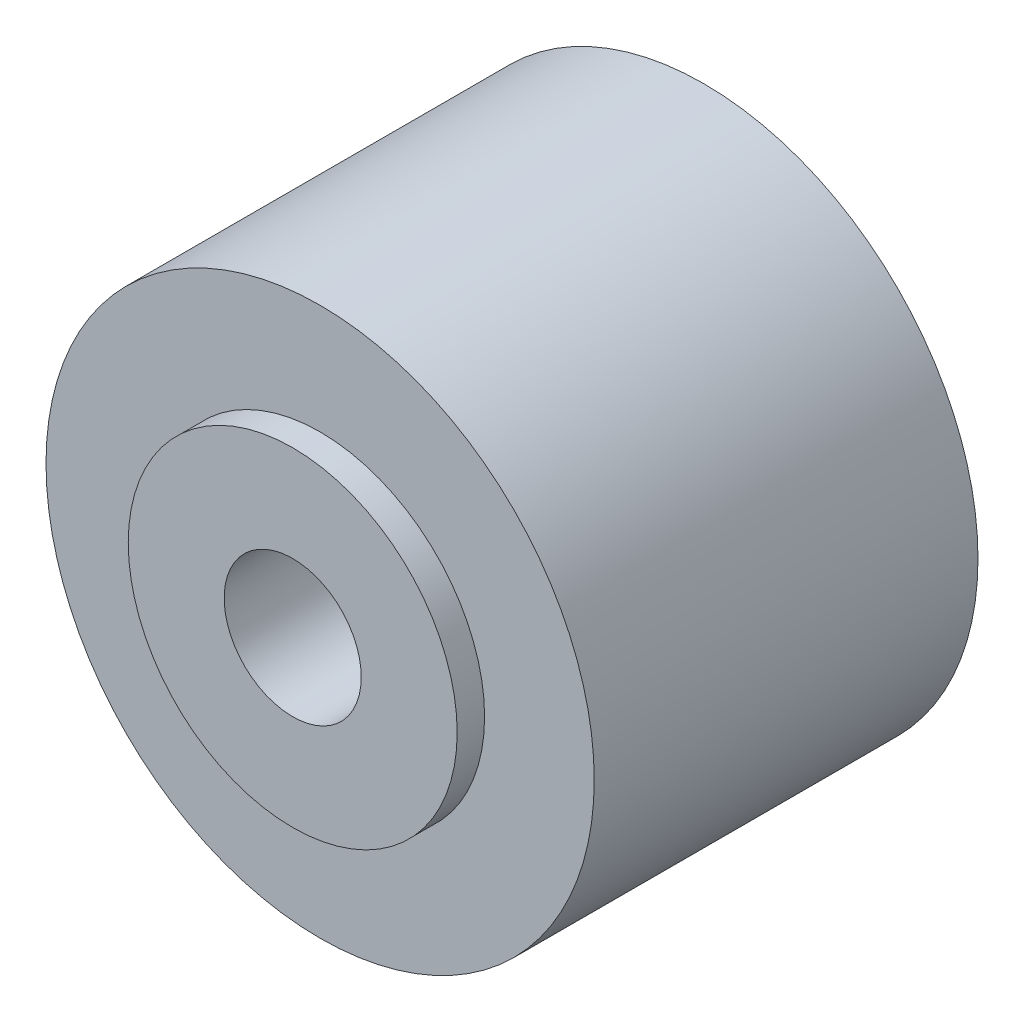
ISO-10303-21;
HEADER;
FILE_DESCRIPTION(('STEP AP214'),'2;1');
FILE_NAME('part.step','',(''),(''),'','','');
FILE_SCHEMA(('AUTOMOTIVE_DESIGN { 1 0 10303 214 1 1 1 1 }'));
ENDSEC;
DATA;
#1=APPLICATION_CONTEXT('core data for automotive mechanical design processes');
#2=APPLICATION_PROTOCOL_DEFINITION('international standard','automotive_design',2000,#1);
#3=PRODUCT_CONTEXT('',#1,'mechanical');
#4=PRODUCT('Part','Part','',(#3));
#5=PRODUCT_RELATED_PRODUCT_CATEGORY('part','',(#4));
#6=PRODUCT_DEFINITION_FORMATION('','',#4);
#7=PRODUCT_DEFINITION_CONTEXT('part definition',#1,'design');
#8=PRODUCT_DEFINITION('design','',#6,#7);
#9=PRODUCT_DEFINITION_SHAPE('','',#8);
#10=(LENGTH_UNIT() NAMED_UNIT(*) SI_UNIT(.MILLI.,.METRE.));
#11=(NAMED_UNIT(*) PLANE_ANGLE_UNIT() SI_UNIT($,.RADIAN.));
#12=(NAMED_UNIT(*) SI_UNIT($,.STERADIAN.) SOLID_ANGLE_UNIT());
#13=UNCERTAINTY_MEASURE_WITH_UNIT(LENGTH_MEASURE(1.E-05),#10,'distance_accuracy_value','');
#14=(GEOMETRIC_REPRESENTATION_CONTEXT(3) GLOBAL_UNCERTAINTY_ASSIGNED_CONTEXT((#13)) GLOBAL_UNIT_ASSIGNED_CONTEXT((#10,
#11,#12)) REPRESENTATION_CONTEXT('',''));
#15=CARTESIAN_POINT('',(0.,0.,0.));
#16=DIRECTION('',(0.,0.,1.));
#17=DIRECTION('',(1.,0.,0.));
#18=AXIS2_PLACEMENT_3D('',#15,#16,#17);
#19=CARTESIAN_POINT('',(0.,0.,4.));
#20=DIRECTION('',(0.,0.,-1.));
#21=DIRECTION('',(-1.,0.,0.));
#22=AXIS2_PLACEMENT_3D('',#19,#20,#21);
#23=CYLINDRICAL_SURFACE('',#22,3.);
#24=CARTESIAN_POINT('',(0.,0.,-4.));
#25=DIRECTION('',(0.,0.,1.));
#26=DIRECTION('',(1.,0.,0.));
#27=AXIS2_PLACEMENT_3D('',#24,#25,#26);
#28=CIRCLE('',#27,3.);
#29=CARTESIAN_POINT('',(3.,0.,-4.));
#30=VERTEX_POINT('',#29);
#31=EDGE_CURVE('E42',#30,#30,#28,.T.);
#32=ORIENTED_EDGE('',*,*,#31,.T.);
#33=EDGE_LOOP('',(#32));
#34=FACE_BOUND('',#33,.T.);
#35=CARTESIAN_POINT('',(0.,0.,-3.5));
#36=DIRECTION('',(0.,0.,1.));
#37=DIRECTION('',(1.,0.,0.));
#38=AXIS2_PLACEMENT_3D('',#35,#36,#37);
#39=CIRCLE('',#38,3.);
#40=CARTESIAN_POINT('',(3.,0.,-3.5));
#41=VERTEX_POINT('',#40);
#42=EDGE_CURVE('E10',#41,#41,#39,.T.);
#43=ORIENTED_EDGE('',*,*,#42,.F.);
#44=EDGE_LOOP('',(#43));
#45=FACE_BOUND('',#44,.T.);
#46=ADVANCED_FACE('F31',(#34,#45),#23,.T.);
#47=CARTESIAN_POINT('',(0.,0.,4.));
#48=DIRECTION('',(0.,0.,1.));
#49=DIRECTION('',(1.,0.,0.));
#50=AXIS2_PLACEMENT_3D('',#47,#48,#49);
#51=PLANE('',#50);
#52=CARTESIAN_POINT('',(0.,0.,4.));
#53=DIRECTION('',(0.,0.,1.));
#54=DIRECTION('',(1.,0.,0.));
#55=AXIS2_PLACEMENT_3D('',#52,#53,#54);
#56=CIRCLE('',#55,3.);
#57=CARTESIAN_POINT('',(3.,0.,4.));
#58=VERTEX_POINT('',#57);
#59=EDGE_CURVE('E38',#58,#58,#56,.T.);
#60=ORIENTED_EDGE('',*,*,#59,.T.);
#61=EDGE_LOOP('',(#60));
#62=FACE_BOUND('',#61,.T.);
#63=CARTESIAN_POINT('',(0.,0.,4.));
#64=DIRECTION('',(0.,0.,1.));
#65=DIRECTION('',(1.,0.,0.));
#66=AXIS2_PLACEMENT_3D('',#63,#64,#65);
#67=CIRCLE('',#66,1.25);
#68=CARTESIAN_POINT('',(1.25,0.,4.));
#69=VERTEX_POINT('',#68);
#70=EDGE_CURVE('E47',#69,#69,#67,.T.);
#71=ORIENTED_EDGE('',*,*,#70,.F.);
#72=EDGE_LOOP('',(#71));
#73=FACE_BOUND('',#72,.T.);
#74=ADVANCED_FACE('F82',(#62,#73),#51,.T.);
#75=CARTESIAN_POINT('',(0.,0.,-4.));
#76=DIRECTION('',(0.,0.,1.));
#77=DIRECTION('',(1.,0.,0.));
#78=AXIS2_PLACEMENT_3D('',#75,#76,#77);
#79=PLANE('',#78);
#80=ORIENTED_EDGE('',*,*,#31,.F.);
#81=EDGE_LOOP('',(#80));
#82=FACE_BOUND('',#81,.T.);
#83=CARTESIAN_POINT('',(0.,0.,-4.));
#84=DIRECTION('',(0.,0.,1.));
#85=DIRECTION('',(1.,0.,0.));
#86=AXIS2_PLACEMENT_3D('',#83,#84,#85);
#87=CIRCLE('',#86,1.25);
#88=CARTESIAN_POINT('',(1.25,0.,-4.));
#89=VERTEX_POINT('',#88);
#90=EDGE_CURVE('E49',#89,#89,#87,.T.);
#91=ORIENTED_EDGE('',*,*,#90,.T.);
#92=EDGE_LOOP('',(#91));
#93=FACE_BOUND('',#92,.T.);
#94=ADVANCED_FACE('F87',(#82,#93),#79,.F.);
#95=CARTESIAN_POINT('',(0.,0.,3.5));
#96=DIRECTION('',(0.,0.,1.));
#97=DIRECTION('',(1.,0.,0.));
#98=AXIS2_PLACEMENT_3D('',#95,#96,#97);
#99=CIRCLE('',#98,3.);
#100=CARTESIAN_POINT('',(3.,0.,3.5));
#101=VERTEX_POINT('',#100);
#102=EDGE_CURVE('E58',#101,#101,#99,.T.);
#103=ORIENTED_EDGE('',*,*,#102,.T.);
#104=EDGE_LOOP('',(#103));
#105=FACE_BOUND('',#104,.T.);
#106=ORIENTED_EDGE('',*,*,#59,.F.);
#107=EDGE_LOOP('',(#106));
#108=FACE_BOUND('',#107,.T.);
#109=ADVANCED_FACE('F33',(#105,#108),#23,.T.);
#110=CARTESIAN_POINT('',(0.,0.,4.));
#111=DIRECTION('',(0.,0.,-1.));
#112=DIRECTION('',(-1.,0.,0.));
#113=AXIS2_PLACEMENT_3D('',#110,#111,#112);
#114=CYLINDRICAL_SURFACE('',#113,1.25);
#115=ORIENTED_EDGE('',*,*,#70,.T.);
#116=EDGE_LOOP('',(#115));
#117=FACE_BOUND('',#116,.T.);
#118=ORIENTED_EDGE('',*,*,#90,.F.);
#119=EDGE_LOOP('',(#118));
#120=FACE_BOUND('',#119,.T.);
#121=ADVANCED_FACE('F69',(#117,#120),#114,.F.);
#122=CARTESIAN_POINT('',(0.,0.,3.5));
#123=DIRECTION('',(0.,0.,1.));
#124=DIRECTION('',(1.,0.,0.));
#125=AXIS2_PLACEMENT_3D('',#122,#123,#124);
#126=PLANE('',#125);
#127=CARTESIAN_POINT('',(0.,0.,3.5));
#128=DIRECTION('',(0.,0.,1.));
#129=DIRECTION('',(1.,0.,0.));
#130=AXIS2_PLACEMENT_3D('',#127,#128,#129);
#131=CIRCLE('',#130,5.);
#132=CARTESIAN_POINT('',(5.,0.,3.5));
#133=VERTEX_POINT('',#132);
#134=EDGE_CURVE('E52',#133,#133,#131,.T.);
#135=ORIENTED_EDGE('',*,*,#134,.T.);
#136=EDGE_LOOP('',(#135));
#137=FACE_BOUND('',#136,.T.);
#138=ORIENTED_EDGE('',*,*,#102,.F.);
#139=EDGE_LOOP('',(#138));
#140=FACE_BOUND('',#139,.T.);
#141=ADVANCED_FACE('F66',(#137,#140),#126,.T.);
#142=CARTESIAN_POINT('',(0.,0.,-3.5));
#143=DIRECTION('',(0.,0.,1.));
#144=DIRECTION('',(1.,0.,0.));
#145=AXIS2_PLACEMENT_3D('',#142,#143,#144);
#146=PLANE('',#145);
#147=CARTESIAN_POINT('',(0.,0.,-3.5));
#148=DIRECTION('',(0.,0.,1.));
#149=DIRECTION('',(1.,0.,0.));
#150=AXIS2_PLACEMENT_3D('',#147,#148,#149);
#151=CIRCLE('',#150,5.);
#152=CARTESIAN_POINT('',(5.,0.,-3.5));
#153=VERTEX_POINT('',#152);
#154=EDGE_CURVE('E55',#153,#153,#151,.T.);
#155=ORIENTED_EDGE('',*,*,#154,.F.);
#156=EDGE_LOOP('',(#155));
#157=FACE_BOUND('',#156,.T.);
#158=ORIENTED_EDGE('',*,*,#42,.T.);
#159=EDGE_LOOP('',(#158));
#160=FACE_BOUND('',#159,.T.);
#161=ADVANCED_FACE('F68',(#157,#160),#146,.F.);
#162=CARTESIAN_POINT('',(0.,0.,3.5));
#163=DIRECTION('',(0.,0.,-1.));
#164=DIRECTION('',(-1.,0.,0.));
#165=AXIS2_PLACEMENT_3D('',#162,#163,#164);
#166=CYLINDRICAL_SURFACE('',#165,5.);
#167=ORIENTED_EDGE('',*,*,#134,.F.);
#168=EDGE_LOOP('',(#167));
#169=FACE_BOUND('',#168,.T.);
#170=ORIENTED_EDGE('',*,*,#154,.T.);
#171=EDGE_LOOP('',(#170));
#172=FACE_BOUND('',#171,.T.);
#173=ADVANCED_FACE('F76',(#169,#172),#166,.T.);
#174=CLOSED_SHELL('',(#46,#74,#94,#109,#121,#141,#161,#173));
#175=MANIFOLD_SOLID_BREP('B2',#174);
#176=ADVANCED_BREP_SHAPE_REPRESENTATION('',(#18,#175),#14);
#177=SHAPE_DEFINITION_REPRESENTATION(#9,#176);
ENDSEC;
END-ISO-10303-21;
